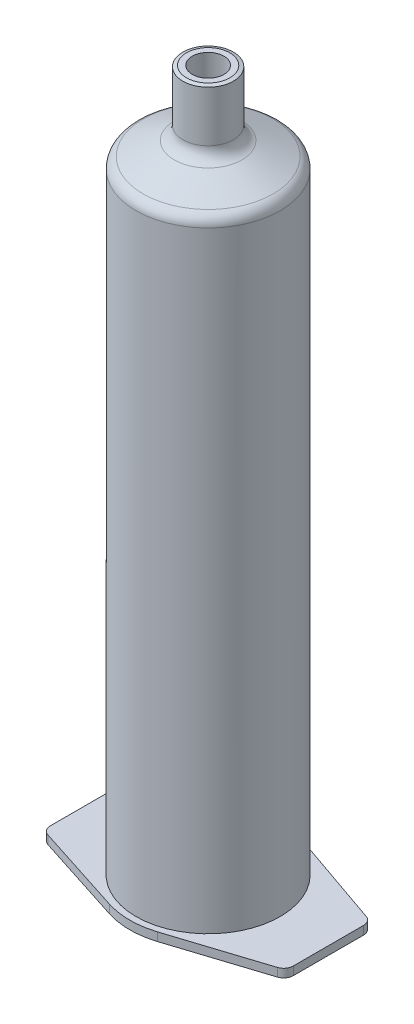
ISO-10303-21;
HEADER;
FILE_DESCRIPTION(('STEP AP214'),'2;1');
FILE_NAME('part.step','',(''),(''),'','','');
FILE_SCHEMA(('AUTOMOTIVE_DESIGN { 1 0 10303 214 1 1 1 1 }'));
ENDSEC;
DATA;
#1=APPLICATION_CONTEXT('core data for automotive mechanical design processes');
#2=APPLICATION_PROTOCOL_DEFINITION('international standard','automotive_design',2000,#1);
#3=PRODUCT_CONTEXT('',#1,'mechanical');
#4=PRODUCT('Part','Part','',(#3));
#5=PRODUCT_RELATED_PRODUCT_CATEGORY('part','',(#4));
#6=PRODUCT_DEFINITION_FORMATION('','',#4);
#7=PRODUCT_DEFINITION_CONTEXT('part definition',#1,'design');
#8=PRODUCT_DEFINITION('design','',#6,#7);
#9=PRODUCT_DEFINITION_SHAPE('','',#8);
#10=(LENGTH_UNIT() NAMED_UNIT(*) SI_UNIT(.MILLI.,.METRE.));
#11=(NAMED_UNIT(*) PLANE_ANGLE_UNIT() SI_UNIT($,.RADIAN.));
#12=(NAMED_UNIT(*) SI_UNIT($,.STERADIAN.) SOLID_ANGLE_UNIT());
#13=UNCERTAINTY_MEASURE_WITH_UNIT(LENGTH_MEASURE(1.E-05),#10,'distance_accuracy_value','');
#14=(GEOMETRIC_REPRESENTATION_CONTEXT(3) GLOBAL_UNCERTAINTY_ASSIGNED_CONTEXT((#13)) GLOBAL_UNIT_ASSIGNED_CONTEXT((#10,
#11,#12)) REPRESENTATION_CONTEXT('',''));
#15=CARTESIAN_POINT('',(0.,0.,0.));
#16=DIRECTION('',(0.,0.,1.));
#17=DIRECTION('',(1.,0.,0.));
#18=AXIS2_PLACEMENT_3D('',#15,#16,#17);
#19=CARTESIAN_POINT('',(-25.25,-120.250000029802,-8.49999986588954));
#20=DIRECTION('',(-0.327472655340762,0.,-0.944860656395466));
#21=DIRECTION('',(-0.944860656395466,0.,0.327472655340762));
#22=AXIS2_PLACEMENT_3D('',#19,#20,#21);
#23=PLANE('',#22);
#24=DIRECTION('',(0.944860656395466,0.,-0.327472655340762));
#25=VECTOR('',#24,1.);
#26=CARTESIAN_POINT('',(-25.25,-120.250000029802,-8.49999986588954));
#27=LINE('',#26,#25);
#28=CARTESIAN_POINT('',(-23.9049453106815,-120.250000029802,-8.96617297586959));
#29=VERTEX_POINT('',#28);
#30=CARTESIAN_POINT('',(-5.33780428205442,-120.250000029802,-15.4012286992461));
#31=VERTEX_POINT('',#30);
#32=EDGE_CURVE('E230',#29,#31,#27,.T.);
#33=ORIENTED_EDGE('',*,*,#32,.T.);
#34=DIRECTION('',(0.,-1.,0.));
#35=VECTOR('',#34,1.);
#36=CARTESIAN_POINT('',(-5.33780428205442,-120.250000029802,-15.4012286992461));
#37=LINE('',#36,#35);
#38=CARTESIAN_POINT('',(-5.33780428205442,-122.000000029802,-15.4012286992461));
#39=VERTEX_POINT('',#38);
#40=EDGE_CURVE('E203',#31,#39,#37,.T.);
#41=ORIENTED_EDGE('',*,*,#40,.T.);
#42=DIRECTION('',(0.944860656395466,0.,-0.327472655340762));
#43=VECTOR('',#42,1.);
#44=CARTESIAN_POINT('',(-25.25,-122.000000029802,-8.49999986588954));
#45=LINE('',#44,#43);
#46=CARTESIAN_POINT('',(-23.9049453106815,-122.000000029802,-8.96617297586959));
#47=VERTEX_POINT('',#46);
#48=EDGE_CURVE('E133',#47,#39,#45,.T.);
#49=ORIENTED_EDGE('',*,*,#48,.F.);
#50=DIRECTION('',(0.,-1.,0.));
#51=VECTOR('',#50,1.);
#52=CARTESIAN_POINT('',(-23.9049453106815,-120.250000029802,-8.96617297586959));
#53=LINE('',#52,#51);
#54=EDGE_CURVE('E180',#47,#29,#53,.F.);
#55=ORIENTED_EDGE('',*,*,#54,.T.);
#56=EDGE_LOOP('',(#33,#41,#49,#55));
#57=FACE_BOUND('',#56,.T.);
#58=ADVANCED_FACE('F33',(#57),#23,.T.);
#59=CARTESIAN_POINT('',(-25.25,-120.250000029802,9.00000013411044));
#60=DIRECTION('',(-1.,0.,0.));
#61=DIRECTION('',(0.,0.,1.));
#62=AXIS2_PLACEMENT_3D('',#59,#60,#61);
#63=PLANE('',#62);
#64=DIRECTION('',(0.,0.,-1.));
#65=VECTOR('',#64,1.);
#66=CARTESIAN_POINT('',(-25.25,-120.250000029802,9.00000013411044));
#67=LINE('',#66,#65);
#68=CARTESIAN_POINT('',(-25.25,-120.250000029802,7.5424405000527));
#69=VERTEX_POINT('',#68);
#70=CARTESIAN_POINT('',(-25.25,-120.250000029802,-7.07645166307864));
#71=VERTEX_POINT('',#70);
#72=EDGE_CURVE('E232',#69,#71,#67,.T.);
#73=ORIENTED_EDGE('',*,*,#72,.T.);
#74=DIRECTION('',(0.,-1.,0.));
#75=VECTOR('',#74,1.);
#76=CARTESIAN_POINT('',(-25.25,-120.250000029802,-7.07645166307864));
#77=LINE('',#76,#75);
#78=CARTESIAN_POINT('',(-25.25,-122.000000029802,-7.07645166307864));
#79=VERTEX_POINT('',#78);
#80=EDGE_CURVE('E177',#71,#79,#77,.T.);
#81=ORIENTED_EDGE('',*,*,#80,.T.);
#82=DIRECTION('',(0.,0.,-1.));
#83=VECTOR('',#82,1.);
#84=CARTESIAN_POINT('',(-25.25,-122.000000029802,9.00000013411044));
#85=LINE('',#84,#83);
#86=CARTESIAN_POINT('',(-25.25,-122.000000029802,7.5424405000527));
#87=VERTEX_POINT('',#86);
#88=EDGE_CURVE('E225',#87,#79,#85,.T.);
#89=ORIENTED_EDGE('',*,*,#88,.F.);
#90=DIRECTION('',(0.,-1.,0.));
#91=VECTOR('',#90,1.);
#92=CARTESIAN_POINT('',(-25.25,-120.250000029802,7.5424405000527));
#93=LINE('',#92,#91);
#94=EDGE_CURVE('E175',#87,#69,#93,.F.);
#95=ORIENTED_EDGE('',*,*,#94,.T.);
#96=EDGE_LOOP('',(#73,#81,#89,#95));
#97=FACE_BOUND('',#96,.T.);
#98=ADVANCED_FACE('F283',(#97),#63,.T.);
#99=CARTESIAN_POINT('',(0.,-120.250000029802,17.1226313975035));
#100=DIRECTION('',(-0.306233327004717,0.,0.951956485051508));
#101=DIRECTION('',(0.951956485051508,0.,0.306233327004717));
#102=AXIS2_PLACEMENT_3D('',#99,#100,#101);
#103=PLANE('',#102);
#104=DIRECTION('',(-0.951956485051508,0.,-0.306233327004717));
#105=VECTOR('',#104,1.);
#106=CARTESIAN_POINT('',(0.,-122.000000029802,17.1226313975035));
#107=LINE('',#106,#105);
#108=CARTESIAN_POINT('',(-4.99160323017682,-122.000000029802,15.5168907063396));
#109=VERTEX_POINT('',#108);
#110=CARTESIAN_POINT('',(-23.8624666540094,-122.000000029802,9.44635347015572));
#111=VERTEX_POINT('',#110);
#112=EDGE_CURVE('E223',#109,#111,#107,.T.);
#113=ORIENTED_EDGE('',*,*,#112,.F.);
#114=DIRECTION('',(0.,-1.,0.));
#115=VECTOR('',#114,1.);
#116=CARTESIAN_POINT('',(-4.99160323017682,-120.250000029802,15.5168907063396));
#117=LINE('',#116,#115);
#118=CARTESIAN_POINT('',(-4.99160323017682,-120.250000029802,15.5168907063396));
#119=VERTEX_POINT('',#118);
#120=EDGE_CURVE('E11',#109,#119,#117,.F.);
#121=ORIENTED_EDGE('',*,*,#120,.T.);
#122=DIRECTION('',(-0.951956485051508,0.,-0.306233327004717));
#123=VECTOR('',#122,1.);
#124=CARTESIAN_POINT('',(0.,-120.250000029802,17.1226313975035));
#125=LINE('',#124,#123);
#126=CARTESIAN_POINT('',(-23.8624666540094,-120.250000029802,9.44635347015572));
#127=VERTEX_POINT('',#126);
#128=EDGE_CURVE('E236',#119,#127,#125,.T.);
#129=ORIENTED_EDGE('',*,*,#128,.T.);
#130=DIRECTION('',(0.,-1.,0.));
#131=VECTOR('',#130,1.);
#132=CARTESIAN_POINT('',(-23.8624666540094,-120.250000029802,9.44635347015572));
#133=LINE('',#132,#131);
#134=EDGE_CURVE('E182',#127,#111,#133,.T.);
#135=ORIENTED_EDGE('',*,*,#134,.T.);
#136=EDGE_LOOP('',(#113,#121,#129,#135));
#137=FACE_BOUND('',#136,.T.);
#138=ADVANCED_FACE('F289',(#137),#103,.T.);
#139=CARTESIAN_POINT('',(25.25,-120.250000029802,9.00000013411048));
#140=DIRECTION('',(0.306233327004717,0.,0.951956485051508));
#141=DIRECTION('',(0.951956485051508,0.,-0.306233327004717));
#142=AXIS2_PLACEMENT_3D('',#139,#140,#141);
#143=PLANE('',#142);
#144=DIRECTION('',(-0.951956485051508,0.,0.306233327004717));
#145=VECTOR('',#144,1.);
#146=CARTESIAN_POINT('',(25.25,-120.250000029802,9.00000013411048));
#147=LINE('',#146,#145);
#148=CARTESIAN_POINT('',(23.8624666540094,-120.250000029802,9.44635347015576));
#149=VERTEX_POINT('',#148);
#150=CARTESIAN_POINT('',(4.99160323017696,-120.250000029802,15.5168907063396));
#151=VERTEX_POINT('',#150);
#152=EDGE_CURVE('E221',#149,#151,#147,.T.);
#153=ORIENTED_EDGE('',*,*,#152,.T.);
#154=DIRECTION('',(0.,-1.,0.));
#155=VECTOR('',#154,1.);
#156=CARTESIAN_POINT('',(4.99160323017695,-120.250000029802,15.5168907063396));
#157=LINE('',#156,#155);
#158=CARTESIAN_POINT('',(4.99160323017696,-122.000000029802,15.5168907063396));
#159=VERTEX_POINT('',#158);
#160=EDGE_CURVE('E41',#151,#159,#157,.T.);
#161=ORIENTED_EDGE('',*,*,#160,.T.);
#162=DIRECTION('',(-0.951956485051508,0.,0.306233327004717));
#163=VECTOR('',#162,1.);
#164=CARTESIAN_POINT('',(25.25,-122.000000029802,9.00000013411048));
#165=LINE('',#164,#163);
#166=CARTESIAN_POINT('',(23.8624666540094,-122.000000029802,9.44635347015576));
#167=VERTEX_POINT('',#166);
#168=EDGE_CURVE('E219',#167,#159,#165,.T.);
#169=ORIENTED_EDGE('',*,*,#168,.F.);
#170=DIRECTION('',(0.,-1.,0.));
#171=VECTOR('',#170,1.);
#172=CARTESIAN_POINT('',(23.8624666540094,-120.250000029802,9.44635347015577));
#173=LINE('',#172,#171);
#174=EDGE_CURVE('E173',#167,#149,#173,.F.);
#175=ORIENTED_EDGE('',*,*,#174,.T.);
#176=EDGE_LOOP('',(#153,#161,#169,#175));
#177=FACE_BOUND('',#176,.T.);
#178=ADVANCED_FACE('F218',(#177),#143,.T.);
#179=CARTESIAN_POINT('',(25.25,-120.250000029802,-8.49999986588954));
#180=DIRECTION('',(1.,0.,0.));
#181=DIRECTION('',(0.,0.,-1.));
#182=AXIS2_PLACEMENT_3D('',#179,#180,#181);
#183=PLANE('',#182);
#184=DIRECTION('',(0.,0.,1.));
#185=VECTOR('',#184,1.);
#186=CARTESIAN_POINT('',(25.25,-122.000000029802,-8.49999986588954));
#187=LINE('',#186,#185);
#188=CARTESIAN_POINT('',(25.25,-122.000000029802,-7.07645166307865));
#189=VERTEX_POINT('',#188);
#190=CARTESIAN_POINT('',(25.25,-122.000000029802,7.54244050005274));
#191=VERTEX_POINT('',#190);
#192=EDGE_CURVE('E132',#189,#191,#187,.T.);
#193=ORIENTED_EDGE('',*,*,#192,.F.);
#194=DIRECTION('',(0.,-1.,0.));
#195=VECTOR('',#194,1.);
#196=CARTESIAN_POINT('',(25.25,-120.250000029802,-7.07645166307865));
#197=LINE('',#196,#195);
#198=CARTESIAN_POINT('',(25.25,-120.250000029802,-7.07645166307865));
#199=VERTEX_POINT('',#198);
#200=EDGE_CURVE('E141',#189,#199,#197,.F.);
#201=ORIENTED_EDGE('',*,*,#200,.T.);
#202=DIRECTION('',(0.,0.,1.));
#203=VECTOR('',#202,1.);
#204=CARTESIAN_POINT('',(25.25,-120.250000029802,-8.49999986588954));
#205=LINE('',#204,#203);
#206=CARTESIAN_POINT('',(25.25,-120.250000029802,7.54244050005274));
#207=VERTEX_POINT('',#206);
#208=EDGE_CURVE('E259',#199,#207,#205,.T.);
#209=ORIENTED_EDGE('',*,*,#208,.T.);
#210=DIRECTION('',(0.,-1.,0.));
#211=VECTOR('',#210,1.);
#212=CARTESIAN_POINT('',(25.25,-120.250000029802,7.54244050005274));
#213=LINE('',#212,#211);
#214=EDGE_CURVE('E142',#207,#191,#213,.T.);
#215=ORIENTED_EDGE('',*,*,#214,.T.);
#216=EDGE_LOOP('',(#193,#201,#209,#215));
#217=FACE_BOUND('',#216,.T.);
#218=ADVANCED_FACE('F264',(#217),#183,.T.);
#219=CARTESIAN_POINT('',(0.,-120.250000029802,-17.251221002452));
#220=DIRECTION('',(0.327472655340762,0.,-0.944860656395466));
#221=DIRECTION('',(-0.944860656395466,0.,-0.327472655340762));
#222=AXIS2_PLACEMENT_3D('',#219,#220,#221);
#223=PLANE('',#222);
#224=DIRECTION('',(0.944860656395466,0.,0.327472655340762));
#225=VECTOR('',#224,1.);
#226=CARTESIAN_POINT('',(0.,-122.000000029802,-17.251221002452));
#227=LINE('',#226,#225);
#228=CARTESIAN_POINT('',(5.33780428205442,-122.000000029802,-15.4012286992461));
#229=VERTEX_POINT('',#228);
#230=CARTESIAN_POINT('',(23.9049453106815,-122.000000029802,-8.96617297586959));
#231=VERTEX_POINT('',#230);
#232=EDGE_CURVE('E121',#229,#231,#227,.T.);
#233=ORIENTED_EDGE('',*,*,#232,.F.);
#234=DIRECTION('',(0.,-1.,0.));
#235=VECTOR('',#234,1.);
#236=CARTESIAN_POINT('',(5.33780428205442,-120.250000029802,-15.4012286992461));
#237=LINE('',#236,#235);
#238=CARTESIAN_POINT('',(5.33780428205442,-120.250000029802,-15.4012286992461));
#239=VERTEX_POINT('',#238);
#240=EDGE_CURVE('E209',#229,#239,#237,.F.);
#241=ORIENTED_EDGE('',*,*,#240,.T.);
#242=DIRECTION('',(0.944860656395466,0.,0.327472655340762));
#243=VECTOR('',#242,1.);
#244=CARTESIAN_POINT('',(0.,-120.250000029802,-17.251221002452));
#245=LINE('',#244,#243);
#246=CARTESIAN_POINT('',(23.9049453106815,-120.250000029802,-8.96617297586959));
#247=VERTEX_POINT('',#246);
#248=EDGE_CURVE('E147',#239,#247,#245,.T.);
#249=ORIENTED_EDGE('',*,*,#248,.T.);
#250=DIRECTION('',(0.,-1.,0.));
#251=VECTOR('',#250,1.);
#252=CARTESIAN_POINT('',(23.9049453106815,-120.250000029802,-8.96617297586959));
#253=LINE('',#252,#251);
#254=EDGE_CURVE('E140',#247,#231,#253,.T.);
#255=ORIENTED_EDGE('',*,*,#254,.T.);
#256=EDGE_LOOP('',(#233,#241,#249,#255));
#257=FACE_BOUND('',#256,.T.);
#258=ADVANCED_FACE('F145',(#257),#223,.T.);
#259=CARTESIAN_POINT('',(0.,-120.250000029802,0.));
#260=DIRECTION('',(0.,-1.,0.));
#261=DIRECTION('',(0.,0.,-1.));
#262=AXIS2_PLACEMENT_3D('',#259,#260,#261);
#263=PLANE('',#262);
#264=CARTESIAN_POINT('',(0.,-120.250000029802,0.));
#265=DIRECTION('',(0.,1.,0.));
#266=DIRECTION('',(0.,0.,1.));
#267=AXIS2_PLACEMENT_3D('',#264,#265,#266);
#268=CIRCLE('',#267,15.0000001043081);
#269=CARTESIAN_POINT('',(0.,-120.250000029802,15.0000001043081));
#270=VERTEX_POINT('',#269);
#271=EDGE_CURVE('E244',#270,#270,#268,.T.);
#272=ORIENTED_EDGE('',*,*,#271,.F.);
#273=EDGE_LOOP('',(#272));
#274=FACE_BOUND('',#273,.T.);
#275=ORIENTED_EDGE('',*,*,#248,.F.);
#276=CARTESIAN_POINT('',(0.,-120.250000029802,0.));
#277=DIRECTION('',(0.,-1.,0.));
#278=DIRECTION('',(0.,0.,-1.));
#279=AXIS2_PLACEMENT_3D('',#276,#277,#278);
#280=CIRCLE('',#279,16.3);
#281=EDGE_CURVE('E212',#239,#31,#280,.F.);
#282=ORIENTED_EDGE('',*,*,#281,.T.);
#283=ORIENTED_EDGE('',*,*,#32,.F.);
#284=CARTESIAN_POINT('',(-23.25,-120.250000029802,-7.07645166307864));
#285=DIRECTION('',(0.,-1.,0.));
#286=DIRECTION('',(0.,0.,-1.));
#287=AXIS2_PLACEMENT_3D('',#284,#285,#286);
#288=CIRCLE('',#287,2.00000000000001);
#289=EDGE_CURVE('E167',#29,#71,#288,.F.);
#290=ORIENTED_EDGE('',*,*,#289,.T.);
#291=ORIENTED_EDGE('',*,*,#72,.F.);
#292=CARTESIAN_POINT('',(-23.25,-120.250000029802,7.5424405000527));
#293=DIRECTION('',(0.,-1.,0.));
#294=DIRECTION('',(0.,0.,-1.));
#295=AXIS2_PLACEMENT_3D('',#292,#293,#294);
#296=CIRCLE('',#295,2.00000000000001);
#297=EDGE_CURVE('E164',#69,#127,#296,.F.);
#298=ORIENTED_EDGE('',*,*,#297,.T.);
#299=ORIENTED_EDGE('',*,*,#128,.F.);
#300=CARTESIAN_POINT('',(0.,-120.250000029802,0.));
#301=DIRECTION('',(0.,-1.,0.));
#302=DIRECTION('',(0.,0.,-1.));
#303=AXIS2_PLACEMENT_3D('',#300,#301,#302);
#304=CIRCLE('',#303,16.3);
#305=EDGE_CURVE('E48',#119,#151,#304,.F.);
#306=ORIENTED_EDGE('',*,*,#305,.T.);
#307=ORIENTED_EDGE('',*,*,#152,.F.);
#308=CARTESIAN_POINT('',(23.25,-120.250000029802,7.54244050005274));
#309=DIRECTION('',(0.,-1.,0.));
#310=DIRECTION('',(0.,0.,-1.));
#311=AXIS2_PLACEMENT_3D('',#308,#309,#310);
#312=CIRCLE('',#311,2.00000000000001);
#313=EDGE_CURVE('E169',#149,#207,#312,.F.);
#314=ORIENTED_EDGE('',*,*,#313,.T.);
#315=ORIENTED_EDGE('',*,*,#208,.F.);
#316=CARTESIAN_POINT('',(23.25,-120.250000029802,-7.07645166307865));
#317=DIRECTION('',(0.,-1.,0.));
#318=DIRECTION('',(0.,0.,-1.));
#319=AXIS2_PLACEMENT_3D('',#316,#317,#318);
#320=CIRCLE('',#319,2.00000000000001);
#321=EDGE_CURVE('E171',#199,#247,#320,.F.);
#322=ORIENTED_EDGE('',*,*,#321,.T.);
#323=EDGE_LOOP('',(#275,#282,#283,#290,#291,#298,#299,#306,#307,#314,#315,#322));
#324=FACE_BOUND('',#323,.T.);
#325=ADVANCED_FACE('F268',(#274,#324),#263,.F.);
#326=CARTESIAN_POINT('',(0.,-122.000000029802,0.));
#327=DIRECTION('',(0.,-1.,0.));
#328=DIRECTION('',(0.,0.,-1.));
#329=AXIS2_PLACEMENT_3D('',#326,#327,#328);
#330=PLANE('',#329);
#331=CARTESIAN_POINT('',(0.,-122.000000029802,0.));
#332=DIRECTION('',(0.,1.,0.));
#333=DIRECTION('',(0.,0.,1.));
#334=AXIS2_PLACEMENT_3D('',#331,#332,#333);
#335=CIRCLE('',#334,14.0000001098535);
#336=CARTESIAN_POINT('',(0.,-122.000000029802,14.0000001098535));
#337=VERTEX_POINT('',#336);
#338=EDGE_CURVE('E252',#337,#337,#335,.T.);
#339=ORIENTED_EDGE('',*,*,#338,.T.);
#340=EDGE_LOOP('',(#339));
#341=FACE_BOUND('',#340,.T.);
#342=ORIENTED_EDGE('',*,*,#48,.T.);
#343=CARTESIAN_POINT('',(0.,-122.000000029802,0.));
#344=DIRECTION('',(0.,-1.,0.));
#345=DIRECTION('',(0.,0.,-1.));
#346=AXIS2_PLACEMENT_3D('',#343,#344,#345);
#347=CIRCLE('',#346,16.3);
#348=EDGE_CURVE('E128',#39,#229,#347,.T.);
#349=ORIENTED_EDGE('',*,*,#348,.T.);
#350=ORIENTED_EDGE('',*,*,#232,.T.);
#351=CARTESIAN_POINT('',(23.25,-122.000000029802,-7.07645166307865));
#352=DIRECTION('',(0.,-1.,0.));
#353=DIRECTION('',(0.,0.,-1.));
#354=AXIS2_PLACEMENT_3D('',#351,#352,#353);
#355=CIRCLE('',#354,2.00000000000001);
#356=EDGE_CURVE('E126',#231,#189,#355,.T.);
#357=ORIENTED_EDGE('',*,*,#356,.T.);
#358=ORIENTED_EDGE('',*,*,#192,.T.);
#359=CARTESIAN_POINT('',(23.25,-122.000000029802,7.54244050005274));
#360=DIRECTION('',(0.,-1.,0.));
#361=DIRECTION('',(0.,0.,-1.));
#362=AXIS2_PLACEMENT_3D('',#359,#360,#361);
#363=CIRCLE('',#362,2.00000000000001);
#364=EDGE_CURVE('E143',#191,#167,#363,.T.);
#365=ORIENTED_EDGE('',*,*,#364,.T.);
#366=ORIENTED_EDGE('',*,*,#168,.T.);
#367=CARTESIAN_POINT('',(0.,-122.000000029802,0.));
#368=DIRECTION('',(0.,-1.,0.));
#369=DIRECTION('',(0.,0.,-1.));
#370=AXIS2_PLACEMENT_3D('',#367,#368,#369);
#371=CIRCLE('',#370,16.3);
#372=EDGE_CURVE('E206',#159,#109,#371,.T.);
#373=ORIENTED_EDGE('',*,*,#372,.T.);
#374=ORIENTED_EDGE('',*,*,#112,.T.);
#375=CARTESIAN_POINT('',(-23.25,-122.000000029802,7.5424405000527));
#376=DIRECTION('',(0.,-1.,0.));
#377=DIRECTION('',(0.,0.,-1.));
#378=AXIS2_PLACEMENT_3D('',#375,#376,#377);
#379=CIRCLE('',#378,2.00000000000001);
#380=EDGE_CURVE('E149',#111,#87,#379,.T.);
#381=ORIENTED_EDGE('',*,*,#380,.T.);
#382=ORIENTED_EDGE('',*,*,#88,.T.);
#383=CARTESIAN_POINT('',(-23.25,-122.000000029802,-7.07645166307864));
#384=DIRECTION('',(0.,-1.,0.));
#385=DIRECTION('',(0.,0.,-1.));
#386=AXIS2_PLACEMENT_3D('',#383,#384,#385);
#387=CIRCLE('',#386,2.00000000000001);
#388=EDGE_CURVE('E152',#79,#47,#387,.T.);
#389=ORIENTED_EDGE('',*,*,#388,.T.);
#390=EDGE_LOOP('',(#342,#349,#350,#357,#358,#365,#366,#373,#374,#381,#382,#389));
#391=FACE_BOUND('',#390,.T.);
#392=ADVANCED_FACE('F124',(#341,#391),#330,.T.);
#393=CARTESIAN_POINT('',(0.,-120.250000029802,0.));
#394=DIRECTION('',(0.,1.,0.));
#395=DIRECTION('',(0.,0.,1.));
#396=AXIS2_PLACEMENT_3D('',#393,#394,#395);
#397=CYLINDRICAL_SURFACE('',#396,15.0000001043081);
#398=CARTESIAN_POINT('',(0.,6.85012686455239,0.));
#399=DIRECTION('',(0.,-1.,0.));
#400=DIRECTION('',(0.,0.,-1.));
#401=AXIS2_PLACEMENT_3D('',#398,#399,#400);
#402=CIRCLE('',#401,15.0000001043081);
#403=CARTESIAN_POINT('',(0.,6.85012686455239,-15.0000001043081));
#404=VERTEX_POINT('',#403);
#405=EDGE_CURVE('E188',#404,#404,#402,.T.);
#406=ORIENTED_EDGE('',*,*,#405,.T.);
#407=EDGE_LOOP('',(#406));
#408=FACE_BOUND('',#407,.T.);
#409=ORIENTED_EDGE('',*,*,#271,.T.);
#410=EDGE_LOOP('',(#409));
#411=FACE_BOUND('',#410,.T.);
#412=ADVANCED_FACE('F277',(#408,#411),#397,.T.);
#413=CARTESIAN_POINT('',(0.,25.545941813192,0.));
#414=DIRECTION('',(0.,-1.,0.));
#415=DIRECTION('',(0.,0.,-1.));
#416=AXIS2_PLACEMENT_3D('',#413,#414,#415);
#417=CONICAL_SURFACE('',#416,4.51051586406947,1.25966621350617);
#418=CARTESIAN_POINT('',(0.,25.3081428986852,0.));
#419=DIRECTION('',(0.,1.,0.));
#420=DIRECTION('',(0.,0.,1.));
#421=AXIS2_PLACEMENT_3D('',#418,#419,#420);
#422=CIRCLE('',#421,5.25000006295188);
#423=CARTESIAN_POINT('',(0.,25.3081428986852,5.25000006295188));
#424=VERTEX_POINT('',#423);
#425=EDGE_CURVE('E247',#424,#424,#422,.T.);
#426=ORIENTED_EDGE('',*,*,#425,.T.);
#427=EDGE_LOOP('',(#426));
#428=FACE_BOUND('',#427,.T.);
#429=CARTESIAN_POINT('',(0.,25.545941813192,0.));
#430=DIRECTION('',(0.,1.,0.));
#431=DIRECTION('',(0.,0.,1.));
#432=AXIS2_PLACEMENT_3D('',#429,#430,#431);
#433=CIRCLE('',#432,4.51051586406947);
#434=CARTESIAN_POINT('',(0.,25.545941813192,4.51051586406947));
#435=VERTEX_POINT('',#434);
#436=EDGE_CURVE('E529',#435,#435,#433,.T.);
#437=ORIENTED_EDGE('',*,*,#436,.F.);
#438=EDGE_LOOP('',(#437));
#439=FACE_BOUND('',#438,.T.);
#440=ADVANCED_FACE('F420',(#428,#439),#417,.T.);
#441=CARTESIAN_POINT('',(0.,-120.250000029802,0.));
#442=DIRECTION('',(0.,1.,0.));
#443=DIRECTION('',(0.,0.,1.));
#444=AXIS2_PLACEMENT_3D('',#441,#442,#443);
#445=CYLINDRICAL_SURFACE('',#444,5.25000006295188);
#446=CARTESIAN_POINT('',(0.,14.7577622062527,0.));
#447=DIRECTION('',(0.,1.,0.));
#448=DIRECTION('',(0.,0.,1.));
#449=AXIS2_PLACEMENT_3D('',#446,#447,#448);
#450=CIRCLE('',#449,5.25000006295188);
#451=CARTESIAN_POINT('',(0.,14.7577622062527,5.25000006295188));
#452=VERTEX_POINT('',#451);
#453=EDGE_CURVE('E191',#452,#452,#450,.T.);
#454=ORIENTED_EDGE('',*,*,#453,.T.);
#455=EDGE_LOOP('',(#454));
#456=FACE_BOUND('',#455,.T.);
#457=ORIENTED_EDGE('',*,*,#425,.F.);
#458=EDGE_LOOP('',(#457));
#459=FACE_BOUND('',#458,.T.);
#460=ADVANCED_FACE('F416',(#456,#459),#445,.T.);
#461=CARTESIAN_POINT('',(0.,12.8081429389874,0.));
#462=DIRECTION('',(0.,-1.,0.));
#463=DIRECTION('',(0.,0.,-1.));
#464=AXIS2_PLACEMENT_3D('',#461,#462,#463);
#465=CONICAL_SURFACE('',#464,5.25000006295188,1.15257199721567);
#466=CARTESIAN_POINT('',(0.,12.016327560392,0.));
#467=DIRECTION('',(0.,-1.,0.));
#468=DIRECTION('',(0.,0.,-1.));
#469=AXIS2_PLACEMENT_3D('',#466,#467,#468);
#470=CIRCLE('',#469,7.03158466479155);
#471=CARTESIAN_POINT('',(0.,12.016327560392,-7.03158466479155));
#472=VERTEX_POINT('',#471);
#473=EDGE_CURVE('E194',#472,#472,#470,.T.);
#474=ORIENTED_EDGE('',*,*,#473,.T.);
#475=EDGE_LOOP('',(#474));
#476=FACE_BOUND('',#475,.T.);
#477=CARTESIAN_POINT('',(0.,9.13465573610304,0.));
#478=DIRECTION('',(0.,1.,0.));
#479=DIRECTION('',(0.,0.,1.));
#480=AXIS2_PLACEMENT_3D('',#477,#478,#479);
#481=CIRCLE('',#480,13.5153462694417);
#482=CARTESIAN_POINT('',(0.,9.13465573610304,13.5153462694417));
#483=VERTEX_POINT('',#482);
#484=EDGE_CURVE('E185',#483,#483,#481,.T.);
#485=ORIENTED_EDGE('',*,*,#484,.T.);
#486=EDGE_LOOP('',(#485));
#487=FACE_BOUND('',#486,.T.);
#488=ADVANCED_FACE('F413',(#476,#487),#465,.T.);
#489=CARTESIAN_POINT('',(0.,-122.000000029802,0.));
#490=DIRECTION('',(0.,1.,0.));
#491=DIRECTION('',(0.,0.,1.));
#492=AXIS2_PLACEMENT_3D('',#489,#490,#491);
#493=CYLINDRICAL_SURFACE('',#492,14.0000001098535);
#494=CARTESIAN_POINT('',(0.,6.85012686208777,0.));
#495=DIRECTION('',(0.,1.,0.));
#496=DIRECTION('',(0.,0.,1.));
#497=AXIS2_PLACEMENT_3D('',#494,#495,#496);
#498=CIRCLE('',#497,14.0000001098535);
#499=CARTESIAN_POINT('',(0.,6.85012686208777,14.0000001098535));
#500=VERTEX_POINT('',#499);
#501=EDGE_CURVE('E155',#500,#500,#498,.T.);
#502=ORIENTED_EDGE('',*,*,#501,.T.);
#503=EDGE_LOOP('',(#502));
#504=FACE_BOUND('',#503,.T.);
#505=ORIENTED_EDGE('',*,*,#338,.F.);
#506=EDGE_LOOP('',(#505));
#507=FACE_BOUND('',#506,.T.);
#508=ADVANCED_FACE('F391',(#504,#507),#493,.F.);
#509=CARTESIAN_POINT('',(0.,50.000000745058,0.));
#510=DIRECTION('',(0.,-1.,0.));
#511=DIRECTION('',(0.,0.,-1.));
#512=AXIS2_PLACEMENT_3D('',#509,#510,#511);
#513=CONICAL_SURFACE('',#512,1.7000000011045,0.0651347812644077);
#514=CARTESIAN_POINT('',(0.,25.545941813192,0.));
#515=DIRECTION('',(0.,-1.,0.));
#516=DIRECTION('',(0.,0.,-1.));
#517=AXIS2_PLACEMENT_3D('',#514,#515,#516);
#518=CIRCLE('',#517,3.29506612938643);
#519=CARTESIAN_POINT('',(0.,25.545941813192,-3.29506612938643));
#520=VERTEX_POINT('',#519);
#521=EDGE_CURVE('E530',#520,#520,#518,.T.);
#522=ORIENTED_EDGE('',*,*,#521,.F.);
#523=EDGE_LOOP('',(#522));
#524=FACE_BOUND('',#523,.T.);
#525=CARTESIAN_POINT('',(0.,14.6085184449668,0.));
#526=DIRECTION('',(0.,1.,0.));
#527=DIRECTION('',(0.,0.,1.));
#528=AXIS2_PLACEMENT_3D('',#525,#526,#527);
#529=CIRCLE('',#528,4.00848199192047);
#530=CARTESIAN_POINT('',(0.,14.6085184449668,4.00848199192047));
#531=VERTEX_POINT('',#530);
#532=EDGE_CURVE('E200',#531,#531,#529,.F.);
#533=ORIENTED_EDGE('',*,*,#532,.T.);
#534=EDGE_LOOP('',(#533));
#535=FACE_BOUND('',#534,.T.);
#536=ADVANCED_FACE('F386',(#524,#535),#513,.F.);
#537=CARTESIAN_POINT('',(0.,12.1956630183974,0.));
#538=DIRECTION('',(0.,-1.,0.));
#539=DIRECTION('',(0.,0.,-1.));
#540=AXIS2_PLACEMENT_3D('',#537,#538,#539);
#541=CONICAL_SURFACE('',#540,4.16586543383027,1.15257199721567);
#542=CARTESIAN_POINT('',(0.,11.2136271900202,0.));
#543=DIRECTION('',(0.,1.,0.));
#544=DIRECTION('',(0.,0.,1.));
#545=AXIS2_PLACEMENT_3D('',#542,#543,#544);
#546=CIRCLE('',#545,6.37544604767899);
#547=CARTESIAN_POINT('',(0.,11.2136271900202,6.37544604767899));
#548=VERTEX_POINT('',#547);
#549=EDGE_CURVE('E197',#548,#548,#546,.T.);
#550=ORIENTED_EDGE('',*,*,#549,.T.);
#551=EDGE_LOOP('',(#550));
#552=FACE_BOUND('',#551,.T.);
#553=CARTESIAN_POINT('',(0.,8.22084418501817,0.));
#554=DIRECTION('',(0.,-1.,0.));
#555=DIRECTION('',(0.,0.,-1.));
#556=AXIS2_PLACEMENT_3D('',#553,#554,#555);
#557=CIRCLE('',#556,13.1092078089337);
#558=CARTESIAN_POINT('',(0.,8.22084418501817,-13.1092078089337));
#559=VERTEX_POINT('',#558);
#560=EDGE_CURVE('E150',#559,#559,#557,.T.);
#561=ORIENTED_EDGE('',*,*,#560,.T.);
#562=EDGE_LOOP('',(#561));
#563=FACE_BOUND('',#562,.T.);
#564=ADVANCED_FACE('F296',(#552,#563),#541,.F.);
#565=CARTESIAN_POINT('',(0.,6.85012686208777,0.));
#566=DIRECTION('',(0.,1.,0.));
#567=DIRECTION('',(0.,0.,1.));
#568=AXIS2_PLACEMENT_3D('',#565,#566,#567);
#569=TOROIDAL_SURFACE('',#568,12.5000001098535,1.50000000000001);
#570=ORIENTED_EDGE('',*,*,#560,.F.);
#571=EDGE_LOOP('',(#570));
#572=FACE_BOUND('',#571,.T.);
#573=ORIENTED_EDGE('',*,*,#501,.F.);
#574=EDGE_LOOP('',(#573));
#575=FACE_BOUND('',#574,.T.);
#576=ADVANCED_FACE('F293',(#572,#575),#569,.F.);
#577=CARTESIAN_POINT('',(23.25,-120.250000029802,-7.07645166307865));
#578=DIRECTION('',(0.,-1.,0.));
#579=DIRECTION('',(0.,0.,-1.));
#580=AXIS2_PLACEMENT_3D('',#577,#578,#579);
#581=CYLINDRICAL_SURFACE('',#580,2.00000000000001);
#582=ORIENTED_EDGE('',*,*,#321,.F.);
#583=ORIENTED_EDGE('',*,*,#200,.F.);
#584=ORIENTED_EDGE('',*,*,#356,.F.);
#585=ORIENTED_EDGE('',*,*,#254,.F.);
#586=EDGE_LOOP('',(#582,#583,#584,#585));
#587=FACE_BOUND('',#586,.T.);
#588=ADVANCED_FACE('F139',(#587),#581,.T.);
#589=CARTESIAN_POINT('',(23.25,-120.250000029802,7.54244050005274));
#590=DIRECTION('',(0.,-1.,0.));
#591=DIRECTION('',(0.,0.,-1.));
#592=AXIS2_PLACEMENT_3D('',#589,#590,#591);
#593=CYLINDRICAL_SURFACE('',#592,2.00000000000001);
#594=ORIENTED_EDGE('',*,*,#313,.F.);
#595=ORIENTED_EDGE('',*,*,#174,.F.);
#596=ORIENTED_EDGE('',*,*,#364,.F.);
#597=ORIENTED_EDGE('',*,*,#214,.F.);
#598=EDGE_LOOP('',(#594,#595,#596,#597));
#599=FACE_BOUND('',#598,.T.);
#600=ADVANCED_FACE('F267',(#599),#593,.T.);
#601=CARTESIAN_POINT('',(-23.25,-120.250000029802,-7.07645166307864));
#602=DIRECTION('',(0.,-1.,0.));
#603=DIRECTION('',(0.,0.,-1.));
#604=AXIS2_PLACEMENT_3D('',#601,#602,#603);
#605=CYLINDRICAL_SURFACE('',#604,2.00000000000001);
#606=ORIENTED_EDGE('',*,*,#289,.F.);
#607=ORIENTED_EDGE('',*,*,#54,.F.);
#608=ORIENTED_EDGE('',*,*,#388,.F.);
#609=ORIENTED_EDGE('',*,*,#80,.F.);
#610=EDGE_LOOP('',(#606,#607,#608,#609));
#611=FACE_BOUND('',#610,.T.);
#612=ADVANCED_FACE('F302',(#611),#605,.T.);
#613=CARTESIAN_POINT('',(-23.25,-120.250000029802,7.5424405000527));
#614=DIRECTION('',(0.,-1.,0.));
#615=DIRECTION('',(0.,0.,-1.));
#616=AXIS2_PLACEMENT_3D('',#613,#614,#615);
#617=CYLINDRICAL_SURFACE('',#616,2.00000000000001);
#618=ORIENTED_EDGE('',*,*,#297,.F.);
#619=ORIENTED_EDGE('',*,*,#94,.F.);
#620=ORIENTED_EDGE('',*,*,#380,.F.);
#621=ORIENTED_EDGE('',*,*,#134,.F.);
#622=EDGE_LOOP('',(#618,#619,#620,#621));
#623=FACE_BOUND('',#622,.T.);
#624=ADVANCED_FACE('F305',(#623),#617,.T.);
#625=CARTESIAN_POINT('',(0.,6.85012686455239,0.));
#626=DIRECTION('',(0.,-1.,0.));
#627=DIRECTION('',(0.,0.,-1.));
#628=AXIS2_PLACEMENT_3D('',#625,#626,#627);
#629=TOROIDAL_SURFACE('',#628,12.5000001043081,2.50000000000001);
#630=ORIENTED_EDGE('',*,*,#405,.F.);
#631=EDGE_LOOP('',(#630));
#632=FACE_BOUND('',#631,.T.);
#633=ORIENTED_EDGE('',*,*,#484,.F.);
#634=EDGE_LOOP('',(#633));
#635=FACE_BOUND('',#634,.T.);
#636=ADVANCED_FACE('F309',(#632,#635),#629,.T.);
#637=CARTESIAN_POINT('',(0.,14.7577622062527,0.));
#638=DIRECTION('',(0.,1.,0.));
#639=DIRECTION('',(0.,0.,1.));
#640=AXIS2_PLACEMENT_3D('',#637,#638,#639);
#641=TOROIDAL_SURFACE('',#640,8.25000006295188,3.);
#642=ORIENTED_EDGE('',*,*,#473,.F.);
#643=EDGE_LOOP('',(#642));
#644=FACE_BOUND('',#643,.T.);
#645=ORIENTED_EDGE('',*,*,#453,.F.);
#646=EDGE_LOOP('',(#645));
#647=FACE_BOUND('',#646,.T.);
#648=ADVANCED_FACE('F313',(#644,#647),#641,.F.);
#649=CARTESIAN_POINT('',(0.,14.8688733845013,0.));
#650=DIRECTION('',(0.,-1.,0.));
#651=DIRECTION('',(0.,0.,-1.));
#652=AXIS2_PLACEMENT_3D('',#649,#650,#651);
#653=TOROIDAL_SURFACE('',#652,7.99999991189277,4.);
#654=ORIENTED_EDGE('',*,*,#532,.F.);
#655=EDGE_LOOP('',(#654));
#656=FACE_BOUND('',#655,.T.);
#657=ORIENTED_EDGE('',*,*,#549,.F.);
#658=EDGE_LOOP('',(#657));
#659=FACE_BOUND('',#658,.T.);
#660=ADVANCED_FACE('F317',(#656,#659),#653,.T.);
#661=CARTESIAN_POINT('',(0.,-120.250000029802,0.));
#662=DIRECTION('',(0.,-1.,0.));
#663=DIRECTION('',(0.,0.,-1.));
#664=AXIS2_PLACEMENT_3D('',#661,#662,#663);
#665=CYLINDRICAL_SURFACE('',#664,16.3);
#666=ORIENTED_EDGE('',*,*,#281,.F.);
#667=ORIENTED_EDGE('',*,*,#240,.F.);
#668=ORIENTED_EDGE('',*,*,#348,.F.);
#669=ORIENTED_EDGE('',*,*,#40,.F.);
#670=EDGE_LOOP('',(#666,#667,#668,#669));
#671=FACE_BOUND('',#670,.T.);
#672=ADVANCED_FACE('F320',(#671),#665,.T.);
#673=CARTESIAN_POINT('',(0.,-120.250000029802,0.));
#674=DIRECTION('',(0.,-1.,0.));
#675=DIRECTION('',(0.,0.,-1.));
#676=AXIS2_PLACEMENT_3D('',#673,#674,#675);
#677=CYLINDRICAL_SURFACE('',#676,16.3);
#678=ORIENTED_EDGE('',*,*,#305,.F.);
#679=ORIENTED_EDGE('',*,*,#120,.F.);
#680=ORIENTED_EDGE('',*,*,#372,.F.);
#681=ORIENTED_EDGE('',*,*,#160,.F.);
#682=EDGE_LOOP('',(#678,#679,#680,#681));
#683=FACE_BOUND('',#682,.T.);
#684=ADVANCED_FACE('F35',(#683),#677,.T.);
#685=CARTESIAN_POINT('',(0.,25.545941813192,0.));
#686=DIRECTION('',(0.,-1.,0.));
#687=DIRECTION('',(0.,0.,-1.));
#688=AXIS2_PLACEMENT_3D('',#685,#686,#687);
#689=PLANE('',#688);
#690=ORIENTED_EDGE('',*,*,#521,.T.);
#691=EDGE_LOOP('',(#690));
#692=FACE_BOUND('',#691,.T.);
#693=ORIENTED_EDGE('',*,*,#436,.T.);
#694=EDGE_LOOP('',(#693));
#695=FACE_BOUND('',#694,.T.);
#696=ADVANCED_FACE('F327',(#692,#695),#689,.F.);
#697=CLOSED_SHELL('',(#58,#98,#138,#178,#218,#258,#325,#392,#412,#440,#460,#488,#508,#536,#564,
#576,#588,#600,#612,#624,#636,#648,#660,#672,#684,#696));
#698=MANIFOLD_SOLID_BREP('B2',#697);
#699=ADVANCED_BREP_SHAPE_REPRESENTATION('',(#18,#698),#14);
#700=SHAPE_DEFINITION_REPRESENTATION(#9,#699);
ENDSEC;
END-ISO-10303-21;
